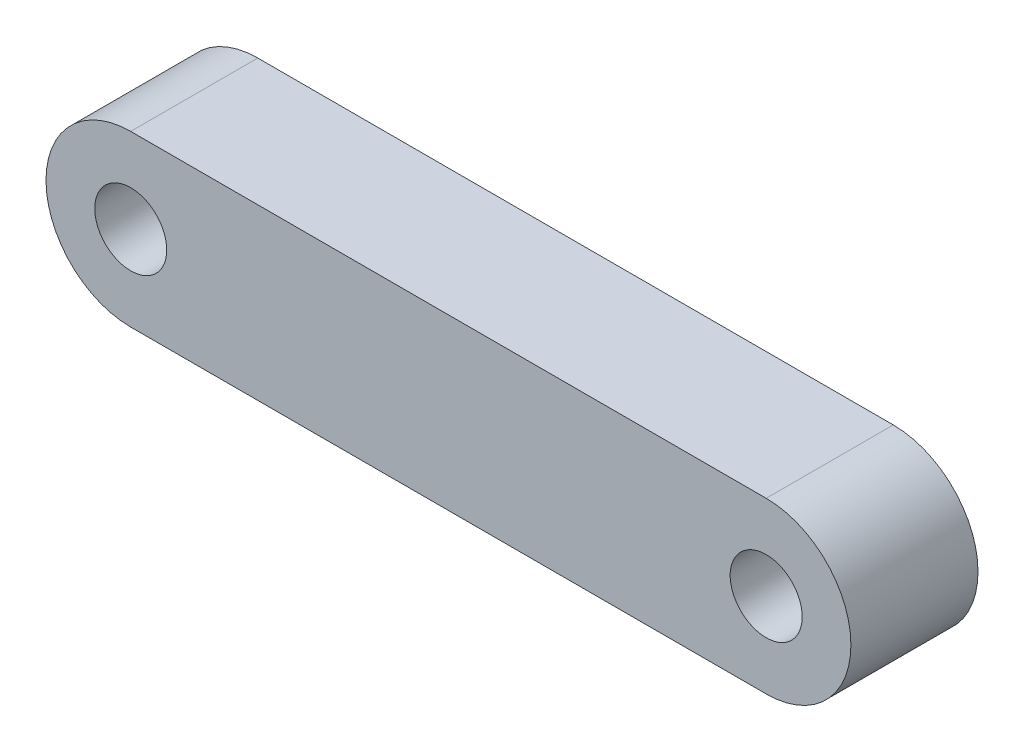
ISO-10303-21;
HEADER;
FILE_DESCRIPTION(('STEP AP214'),'2;1');
FILE_NAME('part.step','',(''),(''),'','','');
FILE_SCHEMA(('AUTOMOTIVE_DESIGN { 1 0 10303 214 1 1 1 1 }'));
ENDSEC;
DATA;
#1=APPLICATION_CONTEXT('core data for automotive mechanical design processes');
#2=APPLICATION_PROTOCOL_DEFINITION('international standard','automotive_design',2000,#1);
#3=PRODUCT_CONTEXT('',#1,'mechanical');
#4=PRODUCT('Part','Part','',(#3));
#5=PRODUCT_RELATED_PRODUCT_CATEGORY('part','',(#4));
#6=PRODUCT_DEFINITION_FORMATION('','',#4);
#7=PRODUCT_DEFINITION_CONTEXT('part definition',#1,'design');
#8=PRODUCT_DEFINITION('design','',#6,#7);
#9=PRODUCT_DEFINITION_SHAPE('','',#8);
#10=(LENGTH_UNIT() NAMED_UNIT(*) SI_UNIT(.MILLI.,.METRE.));
#11=(NAMED_UNIT(*) PLANE_ANGLE_UNIT() SI_UNIT($,.RADIAN.));
#12=(NAMED_UNIT(*) SI_UNIT($,.STERADIAN.) SOLID_ANGLE_UNIT());
#13=UNCERTAINTY_MEASURE_WITH_UNIT(LENGTH_MEASURE(1.E-05),#10,'distance_accuracy_value','');
#14=(GEOMETRIC_REPRESENTATION_CONTEXT(3) GLOBAL_UNCERTAINTY_ASSIGNED_CONTEXT((#13)) GLOBAL_UNIT_ASSIGNED_CONTEXT((#10,
#11,#12)) REPRESENTATION_CONTEXT('',''));
#15=CARTESIAN_POINT('',(0.,0.,0.));
#16=DIRECTION('',(0.,0.,1.));
#17=DIRECTION('',(1.,0.,0.));
#18=AXIS2_PLACEMENT_3D('',#15,#16,#17);
#19=CARTESIAN_POINT('',(0.,0.,6.));
#20=DIRECTION('',(0.,0.,-1.));
#21=DIRECTION('',(-1.,0.,0.));
#22=AXIS2_PLACEMENT_3D('',#19,#20,#21);
#23=CYLINDRICAL_SURFACE('',#22,4.);
#24=CARTESIAN_POINT('',(0.,0.,0.));
#25=DIRECTION('',(0.,0.,1.));
#26=DIRECTION('',(1.,0.,0.));
#27=AXIS2_PLACEMENT_3D('',#24,#25,#26);
#28=CIRCLE('',#27,4.);
#29=CARTESIAN_POINT('',(0.,4.,0.));
#30=VERTEX_POINT('',#29);
#31=CARTESIAN_POINT('',(0.,-4.,0.));
#32=VERTEX_POINT('',#31);
#33=EDGE_CURVE('E99',#30,#32,#28,.T.);
#34=ORIENTED_EDGE('',*,*,#33,.T.);
#35=DIRECTION('',(0.,0.,-1.));
#36=VECTOR('',#35,1.);
#37=CARTESIAN_POINT('',(0.,-4.,6.));
#38=LINE('',#37,#36);
#39=CARTESIAN_POINT('',(0.,-4.,6.));
#40=VERTEX_POINT('',#39);
#41=EDGE_CURVE('E11',#40,#32,#38,.T.);
#42=ORIENTED_EDGE('',*,*,#41,.F.);
#43=CARTESIAN_POINT('',(0.,0.,6.));
#44=DIRECTION('',(0.,0.,1.));
#45=DIRECTION('',(1.,0.,0.));
#46=AXIS2_PLACEMENT_3D('',#43,#44,#45);
#47=CIRCLE('',#46,4.);
#48=CARTESIAN_POINT('',(0.,4.,6.));
#49=VERTEX_POINT('',#48);
#50=EDGE_CURVE('E86',#49,#40,#47,.T.);
#51=ORIENTED_EDGE('',*,*,#50,.F.);
#52=DIRECTION('',(0.,0.,-1.));
#53=VECTOR('',#52,1.);
#54=CARTESIAN_POINT('',(0.,4.,6.));
#55=LINE('',#54,#53);
#56=EDGE_CURVE('E95',#49,#30,#55,.T.);
#57=ORIENTED_EDGE('',*,*,#56,.T.);
#58=EDGE_LOOP('',(#34,#42,#51,#57));
#59=FACE_BOUND('',#58,.T.);
#60=ADVANCED_FACE('F33',(#59),#23,.T.);
#61=CARTESIAN_POINT('',(0.,-4.,6.));
#62=DIRECTION('',(0.,1.,0.));
#63=DIRECTION('',(0.,0.,1.));
#64=AXIS2_PLACEMENT_3D('',#61,#62,#63);
#65=PLANE('',#64);
#66=DIRECTION('',(1.,0.,0.));
#67=VECTOR('',#66,1.);
#68=CARTESIAN_POINT('',(0.,-4.,0.));
#69=LINE('',#68,#67);
#70=CARTESIAN_POINT('',(30.,-4.,0.));
#71=VERTEX_POINT('',#70);
#72=EDGE_CURVE('E90',#32,#71,#69,.T.);
#73=ORIENTED_EDGE('',*,*,#72,.T.);
#74=DIRECTION('',(0.,0.,-1.));
#75=VECTOR('',#74,1.);
#76=CARTESIAN_POINT('',(30.,-4.,6.));
#77=LINE('',#76,#75);
#78=CARTESIAN_POINT('',(30.,-4.,6.));
#79=VERTEX_POINT('',#78);
#80=EDGE_CURVE('E42',#79,#71,#77,.T.);
#81=ORIENTED_EDGE('',*,*,#80,.F.);
#82=DIRECTION('',(1.,0.,0.));
#83=VECTOR('',#82,1.);
#84=CARTESIAN_POINT('',(0.,-4.,6.));
#85=LINE('',#84,#83);
#86=EDGE_CURVE('E81',#40,#79,#85,.T.);
#87=ORIENTED_EDGE('',*,*,#86,.F.);
#88=ORIENTED_EDGE('',*,*,#41,.T.);
#89=EDGE_LOOP('',(#73,#81,#87,#88));
#90=FACE_BOUND('',#89,.T.);
#91=ADVANCED_FACE('F89',(#90),#65,.F.);
#92=CARTESIAN_POINT('',(30.,0.,6.));
#93=DIRECTION('',(0.,0.,-1.));
#94=DIRECTION('',(-1.,0.,0.));
#95=AXIS2_PLACEMENT_3D('',#92,#93,#94);
#96=CYLINDRICAL_SURFACE('',#95,4.);
#97=CARTESIAN_POINT('',(30.,0.,0.));
#98=DIRECTION('',(0.,0.,1.));
#99=DIRECTION('',(1.,0.,0.));
#100=AXIS2_PLACEMENT_3D('',#97,#98,#99);
#101=CIRCLE('',#100,4.);
#102=CARTESIAN_POINT('',(30.,4.,0.));
#103=VERTEX_POINT('',#102);
#104=EDGE_CURVE('E68',#71,#103,#101,.T.);
#105=ORIENTED_EDGE('',*,*,#104,.T.);
#106=DIRECTION('',(0.,0.,-1.));
#107=VECTOR('',#106,1.);
#108=CARTESIAN_POINT('',(30.,4.,6.));
#109=LINE('',#108,#107);
#110=CARTESIAN_POINT('',(30.,4.,6.));
#111=VERTEX_POINT('',#110);
#112=EDGE_CURVE('E91',#111,#103,#109,.T.);
#113=ORIENTED_EDGE('',*,*,#112,.F.);
#114=CARTESIAN_POINT('',(30.,0.,6.));
#115=DIRECTION('',(0.,0.,1.));
#116=DIRECTION('',(1.,0.,0.));
#117=AXIS2_PLACEMENT_3D('',#114,#115,#116);
#118=CIRCLE('',#117,4.);
#119=EDGE_CURVE('E84',#79,#111,#118,.T.);
#120=ORIENTED_EDGE('',*,*,#119,.F.);
#121=ORIENTED_EDGE('',*,*,#80,.T.);
#122=EDGE_LOOP('',(#105,#113,#120,#121));
#123=FACE_BOUND('',#122,.T.);
#124=ADVANCED_FACE('F93',(#123),#96,.T.);
#125=CARTESIAN_POINT('',(0.,4.,6.));
#126=DIRECTION('',(0.,-1.,0.));
#127=DIRECTION('',(0.,0.,-1.));
#128=AXIS2_PLACEMENT_3D('',#125,#126,#127);
#129=PLANE('',#128);
#130=DIRECTION('',(-1.,0.,0.));
#131=VECTOR('',#130,1.);
#132=CARTESIAN_POINT('',(0.,4.,0.));
#133=LINE('',#132,#131);
#134=EDGE_CURVE('E74',#103,#30,#133,.T.);
#135=ORIENTED_EDGE('',*,*,#134,.T.);
#136=ORIENTED_EDGE('',*,*,#56,.F.);
#137=DIRECTION('',(-1.,0.,0.));
#138=VECTOR('',#137,1.);
#139=CARTESIAN_POINT('',(0.,4.,6.));
#140=LINE('',#139,#138);
#141=EDGE_CURVE('E51',#111,#49,#140,.T.);
#142=ORIENTED_EDGE('',*,*,#141,.F.);
#143=ORIENTED_EDGE('',*,*,#112,.T.);
#144=EDGE_LOOP('',(#135,#136,#142,#143));
#145=FACE_BOUND('',#144,.T.);
#146=ADVANCED_FACE('F126',(#145),#129,.F.);
#147=CARTESIAN_POINT('',(0.,0.,6.));
#148=DIRECTION('',(0.,0.,1.));
#149=DIRECTION('',(1.,0.,0.));
#150=AXIS2_PLACEMENT_3D('',#147,#148,#149);
#151=PLANE('',#150);
#152=CARTESIAN_POINT('',(0.,0.,6.));
#153=DIRECTION('',(0.,0.,1.));
#154=DIRECTION('',(1.,0.,0.));
#155=AXIS2_PLACEMENT_3D('',#152,#153,#154);
#156=CIRCLE('',#155,1.7);
#157=CARTESIAN_POINT('',(1.7,0.,6.));
#158=VERTEX_POINT('',#157);
#159=EDGE_CURVE('E108',#158,#158,#156,.T.);
#160=ORIENTED_EDGE('',*,*,#159,.F.);
#161=EDGE_LOOP('',(#160));
#162=FACE_BOUND('',#161,.T.);
#163=CARTESIAN_POINT('',(30.,0.,6.));
#164=DIRECTION('',(0.,0.,1.));
#165=DIRECTION('',(1.,0.,0.));
#166=AXIS2_PLACEMENT_3D('',#163,#164,#165);
#167=CIRCLE('',#166,1.7);
#168=CARTESIAN_POINT('',(31.7,0.,6.));
#169=VERTEX_POINT('',#168);
#170=EDGE_CURVE('E113',#169,#169,#167,.T.);
#171=ORIENTED_EDGE('',*,*,#170,.F.);
#172=EDGE_LOOP('',(#171));
#173=FACE_BOUND('',#172,.T.);
#174=ORIENTED_EDGE('',*,*,#50,.T.);
#175=ORIENTED_EDGE('',*,*,#86,.T.);
#176=ORIENTED_EDGE('',*,*,#119,.T.);
#177=ORIENTED_EDGE('',*,*,#141,.T.);
#178=EDGE_LOOP('',(#174,#175,#176,#177));
#179=FACE_BOUND('',#178,.T.);
#180=ADVANCED_FACE('F82',(#162,#173,#179),#151,.T.);
#181=CARTESIAN_POINT('',(0.,0.,0.));
#182=DIRECTION('',(0.,0.,1.));
#183=DIRECTION('',(1.,0.,0.));
#184=AXIS2_PLACEMENT_3D('',#181,#182,#183);
#185=PLANE('',#184);
#186=CARTESIAN_POINT('',(0.,0.,0.));
#187=DIRECTION('',(0.,0.,1.));
#188=DIRECTION('',(1.,0.,0.));
#189=AXIS2_PLACEMENT_3D('',#186,#187,#188);
#190=CIRCLE('',#189,1.7);
#191=CARTESIAN_POINT('',(1.7,0.,0.));
#192=VERTEX_POINT('',#191);
#193=EDGE_CURVE('E36',#192,#192,#190,.T.);
#194=ORIENTED_EDGE('',*,*,#193,.T.);
#195=EDGE_LOOP('',(#194));
#196=FACE_BOUND('',#195,.T.);
#197=CARTESIAN_POINT('',(30.,0.,0.));
#198=DIRECTION('',(0.,0.,1.));
#199=DIRECTION('',(1.,0.,0.));
#200=AXIS2_PLACEMENT_3D('',#197,#198,#199);
#201=CIRCLE('',#200,1.7);
#202=CARTESIAN_POINT('',(31.7,0.,0.));
#203=VERTEX_POINT('',#202);
#204=EDGE_CURVE('E106',#203,#203,#201,.T.);
#205=ORIENTED_EDGE('',*,*,#204,.T.);
#206=EDGE_LOOP('',(#205));
#207=FACE_BOUND('',#206,.T.);
#208=ORIENTED_EDGE('',*,*,#33,.F.);
#209=ORIENTED_EDGE('',*,*,#134,.F.);
#210=ORIENTED_EDGE('',*,*,#104,.F.);
#211=ORIENTED_EDGE('',*,*,#72,.F.);
#212=EDGE_LOOP('',(#208,#209,#210,#211));
#213=FACE_BOUND('',#212,.T.);
#214=ADVANCED_FACE('F125',(#196,#207,#213),#185,.F.);
#215=CARTESIAN_POINT('',(30.,0.,-4.));
#216=DIRECTION('',(0.,0.,1.));
#217=DIRECTION('',(1.,0.,0.));
#218=AXIS2_PLACEMENT_3D('',#215,#216,#217);
#219=CYLINDRICAL_SURFACE('',#218,1.7);
#220=ORIENTED_EDGE('',*,*,#170,.T.);
#221=EDGE_LOOP('',(#220));
#222=FACE_BOUND('',#221,.T.);
#223=ORIENTED_EDGE('',*,*,#204,.F.);
#224=EDGE_LOOP('',(#223));
#225=FACE_BOUND('',#224,.T.);
#226=ADVANCED_FACE('F121',(#222,#225),#219,.F.);
#227=CARTESIAN_POINT('',(0.,0.,-4.));
#228=DIRECTION('',(0.,0.,1.));
#229=DIRECTION('',(1.,0.,0.));
#230=AXIS2_PLACEMENT_3D('',#227,#228,#229);
#231=CYLINDRICAL_SURFACE('',#230,1.7);
#232=ORIENTED_EDGE('',*,*,#159,.T.);
#233=EDGE_LOOP('',(#232));
#234=FACE_BOUND('',#233,.T.);
#235=ORIENTED_EDGE('',*,*,#193,.F.);
#236=EDGE_LOOP('',(#235));
#237=FACE_BOUND('',#236,.T.);
#238=ADVANCED_FACE('F173',(#234,#237),#231,.F.);
#239=CLOSED_SHELL('',(#60,#91,#124,#146,#180,#214,#226,#238));
#240=MANIFOLD_SOLID_BREP('B2',#239);
#241=ADVANCED_BREP_SHAPE_REPRESENTATION('',(#18,#240),#14);
#242=SHAPE_DEFINITION_REPRESENTATION(#9,#241);
ENDSEC;
END-ISO-10303-21;
